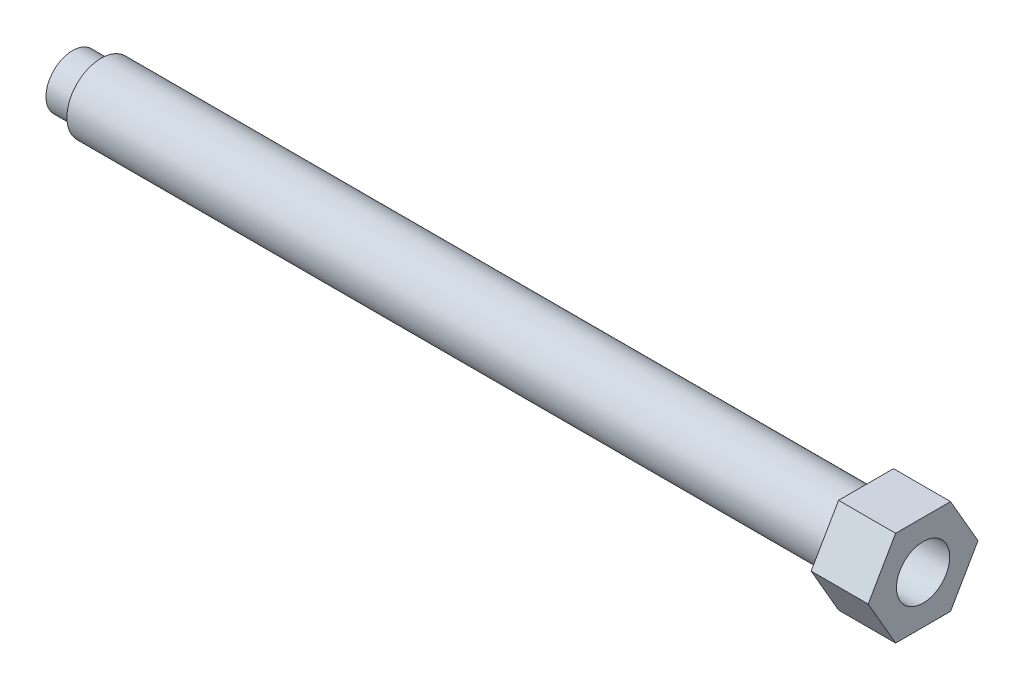
ISO-10303-21;
HEADER;
FILE_DESCRIPTION(('STEP AP214'),'2;1');
FILE_NAME('part.step','',(''),(''),'','','');
FILE_SCHEMA(('AUTOMOTIVE_DESIGN { 1 0 10303 214 1 1 1 1 }'));
ENDSEC;
DATA;
#1=APPLICATION_CONTEXT('core data for automotive mechanical design processes');
#2=APPLICATION_PROTOCOL_DEFINITION('international standard','automotive_design',2000,#1);
#3=PRODUCT_CONTEXT('',#1,'mechanical');
#4=PRODUCT('Part','Part','',(#3));
#5=PRODUCT_RELATED_PRODUCT_CATEGORY('part','',(#4));
#6=PRODUCT_DEFINITION_FORMATION('','',#4);
#7=PRODUCT_DEFINITION_CONTEXT('part definition',#1,'design');
#8=PRODUCT_DEFINITION('design','',#6,#7);
#9=PRODUCT_DEFINITION_SHAPE('','',#8);
#10=(LENGTH_UNIT() NAMED_UNIT(*) SI_UNIT(.MILLI.,.METRE.));
#11=(NAMED_UNIT(*) PLANE_ANGLE_UNIT() SI_UNIT($,.RADIAN.));
#12=(NAMED_UNIT(*) SI_UNIT($,.STERADIAN.) SOLID_ANGLE_UNIT());
#13=UNCERTAINTY_MEASURE_WITH_UNIT(LENGTH_MEASURE(1.E-05),#10,'distance_accuracy_value','');
#14=(GEOMETRIC_REPRESENTATION_CONTEXT(3) GLOBAL_UNCERTAINTY_ASSIGNED_CONTEXT((#13)) GLOBAL_UNIT_ASSIGNED_CONTEXT((#10,
#11,#12)) REPRESENTATION_CONTEXT('',''));
#15=CARTESIAN_POINT('',(0.,0.,0.));
#16=DIRECTION('',(0.,0.,1.));
#17=DIRECTION('',(1.,0.,0.));
#18=AXIS2_PLACEMENT_3D('',#15,#16,#17);
#19=CARTESIAN_POINT('',(-127.687371879,0.,0.));
#20=DIRECTION('',(1.,0.,0.));
#21=DIRECTION('',(0.,0.,-1.));
#22=AXIS2_PLACEMENT_3D('',#19,#20,#21);
#23=PLANE('',#22);
#24=CARTESIAN_POINT('',(-127.687371879,0.,0.));
#25=DIRECTION('',(1.,0.,0.));
#26=DIRECTION('',(0.,0.,-1.));
#27=AXIS2_PLACEMENT_3D('',#24,#25,#26);
#28=CIRCLE('',#27,11.43);
#29=CARTESIAN_POINT('',(-127.687371879,0.,-11.43));
#30=VERTEX_POINT('',#29);
#31=EDGE_CURVE('E155',#30,#30,#28,.T.);
#32=ORIENTED_EDGE('',*,*,#31,.F.);
#33=EDGE_LOOP('',(#32));
#34=FACE_BOUND('',#33,.T.);
#35=CARTESIAN_POINT('',(-127.687371879,0.,0.));
#36=DIRECTION('',(1.,0.,0.));
#37=DIRECTION('',(0.,0.,-1.));
#38=AXIS2_PLACEMENT_3D('',#35,#36,#37);
#39=CIRCLE('',#38,8.89);
#40=CARTESIAN_POINT('',(-127.687371879,0.,-8.89));
#41=VERTEX_POINT('',#40);
#42=EDGE_CURVE('E12',#41,#41,#39,.F.);
#43=ORIENTED_EDGE('',*,*,#42,.F.);
#44=EDGE_LOOP('',(#43));
#45=FACE_BOUND('',#44,.T.);
#46=ADVANCED_FACE('F45',(#34,#45),#23,.F.);
#47=CARTESIAN_POINT('',(127.687371879,0.,0.));
#48=DIRECTION('',(1.,0.,0.));
#49=DIRECTION('',(0.,0.,-1.));
#50=AXIS2_PLACEMENT_3D('',#47,#48,#49);
#51=PLANE('',#50);
#52=CARTESIAN_POINT('',(127.687371879,0.,0.));
#53=DIRECTION('',(1.,0.,0.));
#54=DIRECTION('',(0.,0.,-1.));
#55=AXIS2_PLACEMENT_3D('',#52,#53,#54);
#56=CIRCLE('',#55,6.35);
#57=CARTESIAN_POINT('',(127.687371879,0.,-6.35));
#58=VERTEX_POINT('',#57);
#59=EDGE_CURVE('E152',#58,#58,#56,.T.);
#60=ORIENTED_EDGE('',*,*,#59,.F.);
#61=EDGE_LOOP('',(#60));
#62=FACE_BOUND('',#61,.T.);
#63=CARTESIAN_POINT('',(127.687371879,0.,0.));
#64=DIRECTION('',(1.,0.,0.));
#65=DIRECTION('',(0.,0.,-1.));
#66=AXIS2_PLACEMENT_3D('',#63,#64,#65);
#67=CIRCLE('',#66,8.89);
#68=CARTESIAN_POINT('',(127.687371879,0.,8.89));
#69=VERTEX_POINT('',#68);
#70=EDGE_CURVE('E220',#69,#69,#67,.T.);
#71=ORIENTED_EDGE('',*,*,#70,.T.);
#72=EDGE_LOOP('',(#71));
#73=FACE_BOUND('',#72,.T.);
#74=ADVANCED_FACE('F163',(#62,#73),#51,.T.);
#75=CARTESIAN_POINT('',(-127.687371879,0.,0.));
#76=DIRECTION('',(1.,0.,0.));
#77=DIRECTION('',(0.,0.,-1.));
#78=AXIS2_PLACEMENT_3D('',#75,#76,#77);
#79=CYLINDRICAL_SURFACE('',#78,11.43);
#80=CARTESIAN_POINT('',(127.687371879,0.,0.));
#81=DIRECTION('',(1.,0.,0.));
#82=DIRECTION('',(0.,0.,-1.));
#83=AXIS2_PLACEMENT_3D('',#80,#81,#82);
#84=CIRCLE('',#83,11.43);
#85=CARTESIAN_POINT('',(127.687371879,0.,-11.43));
#86=VERTEX_POINT('',#85);
#87=EDGE_CURVE('E54',#86,#86,#84,.T.);
#88=ORIENTED_EDGE('',*,*,#87,.F.);
#89=EDGE_LOOP('',(#88));
#90=FACE_BOUND('',#89,.T.);
#91=ORIENTED_EDGE('',*,*,#31,.T.);
#92=EDGE_LOOP('',(#91));
#93=FACE_BOUND('',#92,.T.);
#94=ADVANCED_FACE('F47',(#90,#93),#79,.T.);
#95=CARTESIAN_POINT('',(-127.687371879,0.,0.));
#96=DIRECTION('',(1.,0.,0.));
#97=DIRECTION('',(0.,0.,-1.));
#98=AXIS2_PLACEMENT_3D('',#95,#96,#97);
#99=CYLINDRICAL_SURFACE('',#98,6.35);
#100=ORIENTED_EDGE('',*,*,#59,.T.);
#101=EDGE_LOOP('',(#100));
#102=FACE_BOUND('',#101,.T.);
#103=CARTESIAN_POINT('',(-137.212371879,0.,0.));
#104=DIRECTION('',(-1.,0.,0.));
#105=DIRECTION('',(0.,0.,1.));
#106=AXIS2_PLACEMENT_3D('',#103,#104,#105);
#107=CIRCLE('',#106,6.35);
#108=CARTESIAN_POINT('',(-137.212371879,0.,6.35));
#109=VERTEX_POINT('',#108);
#110=EDGE_CURVE('E227',#109,#109,#107,.T.);
#111=ORIENTED_EDGE('',*,*,#110,.T.);
#112=EDGE_LOOP('',(#111));
#113=FACE_BOUND('',#112,.T.);
#114=ADVANCED_FACE('F189',(#102,#113),#99,.F.);
#115=CARTESIAN_POINT('',(127.687371879,0.,0.));
#116=DIRECTION('',(1.,0.,0.));
#117=DIRECTION('',(0.,0.,-1.));
#118=AXIS2_PLACEMENT_3D('',#115,#116,#117);
#119=PLANE('',#118);
#120=DIRECTION('',(0.,0.866025403784438,0.5));
#121=VECTOR('',#120,1.);
#122=CARTESIAN_POINT('',(127.687371879,0.,-18.3308710467706));
#123=LINE('',#122,#121);
#124=CARTESIAN_POINT('',(127.687371879,0.,-18.3308710467706));
#125=VERTEX_POINT('',#124);
#126=CARTESIAN_POINT('',(127.687371879,15.875,-9.1654355233853));
#127=VERTEX_POINT('',#126);
#128=EDGE_CURVE('E132',#125,#127,#123,.T.);
#129=ORIENTED_EDGE('',*,*,#128,.F.);
#130=DIRECTION('',(0.,0.866025403784439,-0.5));
#131=VECTOR('',#130,1.);
#132=CARTESIAN_POINT('',(127.687371879,-15.875,-9.16543552338531));
#133=LINE('',#132,#131);
#134=CARTESIAN_POINT('',(127.687371879,-15.875,-9.16543552338531));
#135=VERTEX_POINT('',#134);
#136=EDGE_CURVE('E91',#135,#125,#133,.T.);
#137=ORIENTED_EDGE('',*,*,#136,.F.);
#138=DIRECTION('',(0.,0.,-1.));
#139=VECTOR('',#138,1.);
#140=CARTESIAN_POINT('',(127.687371879,-15.875,9.16543552338531));
#141=LINE('',#140,#139);
#142=CARTESIAN_POINT('',(127.687371879,-15.875,9.16543552338531));
#143=VERTEX_POINT('',#142);
#144=EDGE_CURVE('E85',#143,#135,#141,.T.);
#145=ORIENTED_EDGE('',*,*,#144,.F.);
#146=DIRECTION('',(0.,-0.866025403784438,-0.5));
#147=VECTOR('',#146,1.);
#148=CARTESIAN_POINT('',(127.687371879,0.,18.3308710467706));
#149=LINE('',#148,#147);
#150=CARTESIAN_POINT('',(127.687371879,0.,18.3308710467706));
#151=VERTEX_POINT('',#150);
#152=EDGE_CURVE('E122',#151,#143,#149,.T.);
#153=ORIENTED_EDGE('',*,*,#152,.F.);
#154=DIRECTION('',(0.,-0.866025403784438,0.5));
#155=VECTOR('',#154,1.);
#156=CARTESIAN_POINT('',(127.687371879,15.875,9.16543552338531));
#157=LINE('',#156,#155);
#158=CARTESIAN_POINT('',(127.687371879,15.875,9.16543552338531));
#159=VERTEX_POINT('',#158);
#160=EDGE_CURVE('E138',#159,#151,#157,.T.);
#161=ORIENTED_EDGE('',*,*,#160,.F.);
#162=DIRECTION('',(0.,0.,1.));
#163=VECTOR('',#162,1.);
#164=CARTESIAN_POINT('',(127.687371879,15.875,-9.1654355233853));
#165=LINE('',#164,#163);
#166=EDGE_CURVE('E135',#127,#159,#165,.T.);
#167=ORIENTED_EDGE('',*,*,#166,.F.);
#168=EDGE_LOOP('',(#129,#137,#145,#153,#161,#167));
#169=FACE_BOUND('',#168,.T.);
#170=ORIENTED_EDGE('',*,*,#87,.T.);
#171=EDGE_LOOP('',(#170));
#172=FACE_BOUND('',#171,.T.);
#173=ADVANCED_FACE('F186',(#169,#172),#119,.F.);
#174=CARTESIAN_POINT('',(146.737371879,0.,0.));
#175=DIRECTION('',(1.,0.,0.));
#176=DIRECTION('',(0.,0.,-1.));
#177=AXIS2_PLACEMENT_3D('',#174,#175,#176);
#178=PLANE('',#177);
#179=DIRECTION('',(0.,0.866025403784438,0.5));
#180=VECTOR('',#179,1.);
#181=CARTESIAN_POINT('',(146.737371879,0.,-18.3308710467706));
#182=LINE('',#181,#180);
#183=CARTESIAN_POINT('',(146.737371879,0.,-18.3308710467706));
#184=VERTEX_POINT('',#183);
#185=CARTESIAN_POINT('',(146.737371879,15.875,-9.1654355233853));
#186=VERTEX_POINT('',#185);
#187=EDGE_CURVE('E143',#184,#186,#182,.T.);
#188=ORIENTED_EDGE('',*,*,#187,.T.);
#189=DIRECTION('',(0.,0.,1.));
#190=VECTOR('',#189,1.);
#191=CARTESIAN_POINT('',(146.737371879,15.875,-9.1654355233853));
#192=LINE('',#191,#190);
#193=CARTESIAN_POINT('',(146.737371879,15.875,9.16543552338531));
#194=VERTEX_POINT('',#193);
#195=EDGE_CURVE('E100',#186,#194,#192,.T.);
#196=ORIENTED_EDGE('',*,*,#195,.T.);
#197=DIRECTION('',(0.,-0.866025403784438,0.5));
#198=VECTOR('',#197,1.);
#199=CARTESIAN_POINT('',(146.737371879,15.875,9.16543552338531));
#200=LINE('',#199,#198);
#201=CARTESIAN_POINT('',(146.737371879,0.,18.3308710467706));
#202=VERTEX_POINT('',#201);
#203=EDGE_CURVE('E114',#194,#202,#200,.T.);
#204=ORIENTED_EDGE('',*,*,#203,.T.);
#205=DIRECTION('',(0.,-0.866025403784438,-0.5));
#206=VECTOR('',#205,1.);
#207=CARTESIAN_POINT('',(146.737371879,0.,18.3308710467706));
#208=LINE('',#207,#206);
#209=CARTESIAN_POINT('',(146.737371879,-15.875,9.16543552338531));
#210=VERTEX_POINT('',#209);
#211=EDGE_CURVE('E107',#202,#210,#208,.T.);
#212=ORIENTED_EDGE('',*,*,#211,.T.);
#213=DIRECTION('',(0.,0.,-1.));
#214=VECTOR('',#213,1.);
#215=CARTESIAN_POINT('',(146.737371879,-15.875,9.16543552338531));
#216=LINE('',#215,#214);
#217=CARTESIAN_POINT('',(146.737371879,-15.875,-9.16543552338531));
#218=VERTEX_POINT('',#217);
#219=EDGE_CURVE('E112',#210,#218,#216,.T.);
#220=ORIENTED_EDGE('',*,*,#219,.T.);
#221=DIRECTION('',(0.,0.866025403784439,-0.5));
#222=VECTOR('',#221,1.);
#223=CARTESIAN_POINT('',(146.737371879,-15.875,-9.16543552338531));
#224=LINE('',#223,#222);
#225=EDGE_CURVE('E62',#218,#184,#224,.T.);
#226=ORIENTED_EDGE('',*,*,#225,.T.);
#227=EDGE_LOOP('',(#188,#196,#204,#212,#220,#226));
#228=FACE_BOUND('',#227,.T.);
#229=CARTESIAN_POINT('',(146.737371879,0.,0.));
#230=DIRECTION('',(1.,0.,0.));
#231=DIRECTION('',(0.,0.,-1.));
#232=AXIS2_PLACEMENT_3D('',#229,#230,#231);
#233=CIRCLE('',#232,8.89);
#234=CARTESIAN_POINT('',(146.737371879,0.,8.89));
#235=VERTEX_POINT('',#234);
#236=EDGE_CURVE('E136',#235,#235,#233,.T.);
#237=ORIENTED_EDGE('',*,*,#236,.F.);
#238=EDGE_LOOP('',(#237));
#239=FACE_BOUND('',#238,.T.);
#240=ADVANCED_FACE('F109',(#228,#239),#178,.T.);
#241=CARTESIAN_POINT('',(146.737371879,0.,-18.3308710467706));
#242=DIRECTION('',(0.,-0.5,0.866025403784438));
#243=DIRECTION('',(0.,-0.866025403784438,-0.5));
#244=AXIS2_PLACEMENT_3D('',#241,#242,#243);
#245=PLANE('',#244);
#246=ORIENTED_EDGE('',*,*,#128,.T.);
#247=DIRECTION('',(-1.,0.,0.));
#248=VECTOR('',#247,1.);
#249=CARTESIAN_POINT('',(146.737371879,15.875,-9.1654355233853));
#250=LINE('',#249,#248);
#251=EDGE_CURVE('E150',#186,#127,#250,.T.);
#252=ORIENTED_EDGE('',*,*,#251,.F.);
#253=ORIENTED_EDGE('',*,*,#187,.F.);
#254=DIRECTION('',(-1.,0.,0.));
#255=VECTOR('',#254,1.);
#256=CARTESIAN_POINT('',(146.737371879,0.,-18.3308710467706));
#257=LINE('',#256,#255);
#258=EDGE_CURVE('E128',#184,#125,#257,.T.);
#259=ORIENTED_EDGE('',*,*,#258,.T.);
#260=EDGE_LOOP('',(#246,#252,#253,#259));
#261=FACE_BOUND('',#260,.T.);
#262=ADVANCED_FACE('F185',(#261),#245,.F.);
#263=CARTESIAN_POINT('',(146.737371879,15.875,-9.1654355233853));
#264=DIRECTION('',(0.,-1.,0.));
#265=DIRECTION('',(0.,0.,-1.));
#266=AXIS2_PLACEMENT_3D('',#263,#264,#265);
#267=PLANE('',#266);
#268=ORIENTED_EDGE('',*,*,#166,.T.);
#269=DIRECTION('',(-1.,0.,0.));
#270=VECTOR('',#269,1.);
#271=CARTESIAN_POINT('',(146.737371879,15.875,9.16543552338531));
#272=LINE('',#271,#270);
#273=EDGE_CURVE('E147',#194,#159,#272,.T.);
#274=ORIENTED_EDGE('',*,*,#273,.F.);
#275=ORIENTED_EDGE('',*,*,#195,.F.);
#276=ORIENTED_EDGE('',*,*,#251,.T.);
#277=EDGE_LOOP('',(#268,#274,#275,#276));
#278=FACE_BOUND('',#277,.T.);
#279=ADVANCED_FACE('F200',(#278),#267,.F.);
#280=CARTESIAN_POINT('',(146.737371879,15.875,9.16543552338531));
#281=DIRECTION('',(0.,-0.5,-0.866025403784439));
#282=DIRECTION('',(0.,0.866025403784438,-0.5));
#283=AXIS2_PLACEMENT_3D('',#280,#281,#282);
#284=PLANE('',#283);
#285=ORIENTED_EDGE('',*,*,#160,.T.);
#286=DIRECTION('',(-1.,0.,0.));
#287=VECTOR('',#286,1.);
#288=CARTESIAN_POINT('',(146.737371879,0.,18.3308710467706));
#289=LINE('',#288,#287);
#290=EDGE_CURVE('E123',#202,#151,#289,.T.);
#291=ORIENTED_EDGE('',*,*,#290,.F.);
#292=ORIENTED_EDGE('',*,*,#203,.F.);
#293=ORIENTED_EDGE('',*,*,#273,.T.);
#294=EDGE_LOOP('',(#285,#291,#292,#293));
#295=FACE_BOUND('',#294,.T.);
#296=ADVANCED_FACE('F197',(#295),#284,.F.);
#297=CARTESIAN_POINT('',(146.737371879,0.,18.3308710467706));
#298=DIRECTION('',(0.,0.5,-0.866025403784439));
#299=DIRECTION('',(0.,0.866025403784438,0.5));
#300=AXIS2_PLACEMENT_3D('',#297,#298,#299);
#301=PLANE('',#300);
#302=ORIENTED_EDGE('',*,*,#152,.T.);
#303=DIRECTION('',(-1.,0.,0.));
#304=VECTOR('',#303,1.);
#305=CARTESIAN_POINT('',(146.737371879,-15.875,9.16543552338531));
#306=LINE('',#305,#304);
#307=EDGE_CURVE('E119',#210,#143,#306,.T.);
#308=ORIENTED_EDGE('',*,*,#307,.F.);
#309=ORIENTED_EDGE('',*,*,#211,.F.);
#310=ORIENTED_EDGE('',*,*,#290,.T.);
#311=EDGE_LOOP('',(#302,#308,#309,#310));
#312=FACE_BOUND('',#311,.T.);
#313=ADVANCED_FACE('F120',(#312),#301,.F.);
#314=CARTESIAN_POINT('',(146.737371879,-15.875,9.16543552338531));
#315=DIRECTION('',(0.,1.,0.));
#316=DIRECTION('',(0.,0.,1.));
#317=AXIS2_PLACEMENT_3D('',#314,#315,#316);
#318=PLANE('',#317);
#319=ORIENTED_EDGE('',*,*,#144,.T.);
#320=DIRECTION('',(-1.,0.,0.));
#321=VECTOR('',#320,1.);
#322=CARTESIAN_POINT('',(146.737371879,-15.875,-9.16543552338531));
#323=LINE('',#322,#321);
#324=EDGE_CURVE('E124',#218,#135,#323,.T.);
#325=ORIENTED_EDGE('',*,*,#324,.F.);
#326=ORIENTED_EDGE('',*,*,#219,.F.);
#327=ORIENTED_EDGE('',*,*,#307,.T.);
#328=EDGE_LOOP('',(#319,#325,#326,#327));
#329=FACE_BOUND('',#328,.T.);
#330=ADVANCED_FACE('F126',(#329),#318,.F.);
#331=CARTESIAN_POINT('',(146.737371879,-15.875,-9.16543552338531));
#332=DIRECTION('',(0.,0.5,0.866025403784439));
#333=DIRECTION('',(0.,-0.866025403784438,0.5));
#334=AXIS2_PLACEMENT_3D('',#331,#332,#333);
#335=PLANE('',#334);
#336=ORIENTED_EDGE('',*,*,#136,.T.);
#337=ORIENTED_EDGE('',*,*,#258,.F.);
#338=ORIENTED_EDGE('',*,*,#225,.F.);
#339=ORIENTED_EDGE('',*,*,#324,.T.);
#340=EDGE_LOOP('',(#336,#337,#338,#339));
#341=FACE_BOUND('',#340,.T.);
#342=ADVANCED_FACE('F181',(#341),#335,.F.);
#343=CARTESIAN_POINT('',(146.737371879,0.,0.));
#344=DIRECTION('',(-1.,0.,0.));
#345=DIRECTION('',(0.,0.,1.));
#346=AXIS2_PLACEMENT_3D('',#343,#344,#345);
#347=CYLINDRICAL_SURFACE('',#346,8.89);
#348=CARTESIAN_POINT('',(146.737371879,0.,8.89));
#349=CARTESIAN_POINT('',(146.538934379,0.,8.89));
#350=CARTESIAN_POINT('',(146.340496879,0.,8.89));
#351=CARTESIAN_POINT('',(145.943621879,0.,8.89));
#352=CARTESIAN_POINT('',(145.745184379,0.,8.89));
#353=CARTESIAN_POINT('',(145.348309379,0.,8.89));
#354=CARTESIAN_POINT('',(145.149871879,0.,8.89));
#355=CARTESIAN_POINT('',(144.752996879,0.,8.89));
#356=CARTESIAN_POINT('',(144.554559379,0.,8.89));
#357=CARTESIAN_POINT('',(144.157684379,0.,8.89));
#358=CARTESIAN_POINT('',(143.959246879,0.,8.89));
#359=CARTESIAN_POINT('',(143.562371879,0.,8.89));
#360=CARTESIAN_POINT('',(143.363934379,0.,8.89));
#361=CARTESIAN_POINT('',(142.967059379,0.,8.89));
#362=CARTESIAN_POINT('',(142.768621879,0.,8.89));
#363=CARTESIAN_POINT('',(142.371746879,0.,8.89));
#364=CARTESIAN_POINT('',(142.173309379,0.,8.89));
#365=CARTESIAN_POINT('',(141.776434379,0.,8.89));
#366=CARTESIAN_POINT('',(141.577996879,0.,8.89));
#367=CARTESIAN_POINT('',(141.181121879,0.,8.89));
#368=CARTESIAN_POINT('',(140.982684379,0.,8.89));
#369=CARTESIAN_POINT('',(140.585809379,0.,8.89));
#370=CARTESIAN_POINT('',(140.387371879,0.,8.89));
#371=CARTESIAN_POINT('',(139.990496879,0.,8.89));
#372=CARTESIAN_POINT('',(139.792059379,0.,8.89));
#373=CARTESIAN_POINT('',(139.395184379,0.,8.89));
#374=CARTESIAN_POINT('',(139.196746879,0.,8.89));
#375=CARTESIAN_POINT('',(138.799871879,0.,8.89));
#376=CARTESIAN_POINT('',(138.601434379,0.,8.89));
#377=CARTESIAN_POINT('',(138.204559379,0.,8.89));
#378=CARTESIAN_POINT('',(138.006121879,0.,8.89));
#379=CARTESIAN_POINT('',(137.609246879,0.,8.89));
#380=CARTESIAN_POINT('',(137.410809379,0.,8.89));
#381=CARTESIAN_POINT('',(137.013934379,0.,8.89));
#382=CARTESIAN_POINT('',(136.815496879,0.,8.89));
#383=CARTESIAN_POINT('',(136.418621879,0.,8.89));
#384=CARTESIAN_POINT('',(136.220184379,0.,8.89));
#385=CARTESIAN_POINT('',(135.823309379,0.,8.89));
#386=CARTESIAN_POINT('',(135.624871879,0.,8.89));
#387=CARTESIAN_POINT('',(135.227996879,0.,8.89));
#388=CARTESIAN_POINT('',(135.029559379,0.,8.89));
#389=CARTESIAN_POINT('',(134.632684379,0.,8.89));
#390=CARTESIAN_POINT('',(134.434246879,0.,8.89));
#391=CARTESIAN_POINT('',(134.037371879,0.,8.89));
#392=CARTESIAN_POINT('',(133.838934379,0.,8.89));
#393=CARTESIAN_POINT('',(133.442059379,0.,8.89));
#394=CARTESIAN_POINT('',(133.243621879,0.,8.89));
#395=CARTESIAN_POINT('',(132.846746879,0.,8.89));
#396=CARTESIAN_POINT('',(132.648309379,0.,8.89));
#397=CARTESIAN_POINT('',(132.251434379,0.,8.89));
#398=CARTESIAN_POINT('',(132.052996879,0.,8.89));
#399=CARTESIAN_POINT('',(131.656121879,0.,8.89));
#400=CARTESIAN_POINT('',(131.457684379,0.,8.89));
#401=CARTESIAN_POINT('',(131.060809379,0.,8.89));
#402=CARTESIAN_POINT('',(130.862371879,0.,8.89));
#403=CARTESIAN_POINT('',(130.465496879,0.,8.89));
#404=CARTESIAN_POINT('',(130.267059379,0.,8.89));
#405=CARTESIAN_POINT('',(129.870184379,0.,8.89));
#406=CARTESIAN_POINT('',(129.671746879,0.,8.89));
#407=CARTESIAN_POINT('',(129.274871879,0.,8.89));
#408=CARTESIAN_POINT('',(129.076434379,0.,8.89));
#409=CARTESIAN_POINT('',(128.679559379,0.,8.89));
#410=CARTESIAN_POINT('',(128.481121879,0.,8.89));
#411=CARTESIAN_POINT('',(128.084246879,0.,8.89));
#412=CARTESIAN_POINT('',(127.885809379,0.,8.89));
#413=CARTESIAN_POINT('',(127.687371879,0.,8.89));
#414=B_SPLINE_CURVE_WITH_KNOTS('',3,(#348,#349,#350,#351,#352,#353,#354,#355,#356,#357,#358,
#359,#360,#361,#362,#363,#364,#365,#366,#367,#368,#369,#370,#371,#372,#373,#374,#375,#376,#377,
#378,#379,#380,#381,#382,#383,#384,#385,#386,#387,#388,#389,#390,#391,#392,#393,#394,#395,#396,
#397,#398,#399,#400,#401,#402,#403,#404,#405,#406,#407,#408,#409,#410,#411,#412,#413),
.UNSPECIFIED.,.F.,.F.,(4,2,2,2,2,2,2,2,2,2,2,2,2,2,2,2,2,2,2,2,2,2,2,2,2,2,2,2,2,2,2,2,4),(0.,
0.5953125,1.190625,1.7859375,2.38125,2.9765625,3.571875,4.1671875,4.7625,5.3578125,5.953125,
6.5484375,7.14375,7.7390625,8.334375,8.92968750000001,9.52500000000001,10.1203125,10.715625,
11.3109375,11.90625,12.5015625,13.096875,13.6921875,14.2875,14.8828125,15.478125,16.0734375,
16.66875,17.2640625,17.859375,18.4546875,19.05),.UNSPECIFIED.);
#415=EDGE_CURVE('BSEAM174',#235,#69,#414,.T.);
#416=ORIENTED_EDGE('',*,*,#236,.T.);
#417=ORIENTED_EDGE('',*,*,#70,.F.);
#418=ORIENTED_EDGE('',*,*,#415,.T.);
#419=ORIENTED_EDGE('',*,*,#415,.F.);
#420=EDGE_LOOP('',(#416,#418,#417,#419));
#421=FACE_BOUND('',#420,.T.);
#422=ADVANCED_FACE('F174',(#421),#347,.F.);
#423=CARTESIAN_POINT('',(-137.212371879,0.,0.));
#424=DIRECTION('',(-1.,0.,0.));
#425=DIRECTION('',(0.,0.,1.));
#426=AXIS2_PLACEMENT_3D('',#423,#424,#425);
#427=PLANE('',#426);
#428=CARTESIAN_POINT('',(-137.212371879,0.,0.));
#429=DIRECTION('',(-1.,0.,0.));
#430=DIRECTION('',(0.,0.,1.));
#431=AXIS2_PLACEMENT_3D('',#428,#429,#430);
#432=CIRCLE('',#431,8.89);
#433=CARTESIAN_POINT('',(-137.212371879,0.,-8.89));
#434=VERTEX_POINT('',#433);
#435=EDGE_CURVE('E222',#434,#434,#432,.T.);
#436=ORIENTED_EDGE('',*,*,#435,.T.);
#437=EDGE_LOOP('',(#436));
#438=FACE_BOUND('',#437,.T.);
#439=ORIENTED_EDGE('',*,*,#110,.F.);
#440=EDGE_LOOP('',(#439));
#441=FACE_BOUND('',#440,.T.);
#442=ADVANCED_FACE('F168',(#438,#441),#427,.T.);
#443=CARTESIAN_POINT('',(-137.212371879,0.,0.));
#444=DIRECTION('',(1.,0.,0.));
#445=DIRECTION('',(0.,0.,-1.));
#446=AXIS2_PLACEMENT_3D('',#443,#444,#445);
#447=CYLINDRICAL_SURFACE('',#446,8.89);
#448=CARTESIAN_POINT('',(-137.212371879,0.,-8.89));
#449=CARTESIAN_POINT('',(-137.113153129,0.,-8.89));
#450=CARTESIAN_POINT('',(-137.013934379,0.,-8.89));
#451=CARTESIAN_POINT('',(-136.815496879,0.,-8.89));
#452=CARTESIAN_POINT('',(-136.716278129,0.,-8.89));
#453=CARTESIAN_POINT('',(-136.517840629,0.,-8.89));
#454=CARTESIAN_POINT('',(-136.418621879,0.,-8.89));
#455=CARTESIAN_POINT('',(-136.220184379,0.,-8.89));
#456=CARTESIAN_POINT('',(-136.120965629,0.,-8.89));
#457=CARTESIAN_POINT('',(-135.922528129,0.,-8.89));
#458=CARTESIAN_POINT('',(-135.823309379,0.,-8.89));
#459=CARTESIAN_POINT('',(-135.624871879,0.,-8.89));
#460=CARTESIAN_POINT('',(-135.525653129,0.,-8.89));
#461=CARTESIAN_POINT('',(-135.327215629,0.,-8.89));
#462=CARTESIAN_POINT('',(-135.227996879,0.,-8.89));
#463=CARTESIAN_POINT('',(-135.029559379,0.,-8.89));
#464=CARTESIAN_POINT('',(-134.930340629,0.,-8.89));
#465=CARTESIAN_POINT('',(-134.731903129,0.,-8.89));
#466=CARTESIAN_POINT('',(-134.632684379,0.,-8.89));
#467=CARTESIAN_POINT('',(-134.434246879,0.,-8.89));
#468=CARTESIAN_POINT('',(-134.335028129,0.,-8.89));
#469=CARTESIAN_POINT('',(-134.136590629,0.,-8.89));
#470=CARTESIAN_POINT('',(-134.037371879,0.,-8.89));
#471=CARTESIAN_POINT('',(-133.838934379,0.,-8.89));
#472=CARTESIAN_POINT('',(-133.739715629,0.,-8.89));
#473=CARTESIAN_POINT('',(-133.541278129,0.,-8.89));
#474=CARTESIAN_POINT('',(-133.442059379,0.,-8.89));
#475=CARTESIAN_POINT('',(-133.243621879,0.,-8.89));
#476=CARTESIAN_POINT('',(-133.144403129,0.,-8.89));
#477=CARTESIAN_POINT('',(-132.945965629,0.,-8.89));
#478=CARTESIAN_POINT('',(-132.846746879,0.,-8.89));
#479=CARTESIAN_POINT('',(-132.648309379,0.,-8.89));
#480=CARTESIAN_POINT('',(-132.549090629,0.,-8.89));
#481=CARTESIAN_POINT('',(-132.350653129,0.,-8.89));
#482=CARTESIAN_POINT('',(-132.251434379,0.,-8.89));
#483=CARTESIAN_POINT('',(-132.052996879,0.,-8.89));
#484=CARTESIAN_POINT('',(-131.953778129,0.,-8.89));
#485=CARTESIAN_POINT('',(-131.755340629,0.,-8.89));
#486=CARTESIAN_POINT('',(-131.656121879,0.,-8.89));
#487=CARTESIAN_POINT('',(-131.457684379,0.,-8.89));
#488=CARTESIAN_POINT('',(-131.358465629,0.,-8.89));
#489=CARTESIAN_POINT('',(-131.160028129,0.,-8.89));
#490=CARTESIAN_POINT('',(-131.060809379,0.,-8.89));
#491=CARTESIAN_POINT('',(-130.862371879,0.,-8.89));
#492=CARTESIAN_POINT('',(-130.763153129,0.,-8.89));
#493=CARTESIAN_POINT('',(-130.564715629,0.,-8.89));
#494=CARTESIAN_POINT('',(-130.465496879,0.,-8.89));
#495=CARTESIAN_POINT('',(-130.267059379,0.,-8.89));
#496=CARTESIAN_POINT('',(-130.167840629,0.,-8.89));
#497=CARTESIAN_POINT('',(-129.969403129,0.,-8.89));
#498=CARTESIAN_POINT('',(-129.870184379,0.,-8.89));
#499=CARTESIAN_POINT('',(-129.671746879,0.,-8.89));
#500=CARTESIAN_POINT('',(-129.572528129,0.,-8.89));
#501=CARTESIAN_POINT('',(-129.374090629,0.,-8.89));
#502=CARTESIAN_POINT('',(-129.274871879,0.,-8.89));
#503=CARTESIAN_POINT('',(-129.076434379,0.,-8.89));
#504=CARTESIAN_POINT('',(-128.977215629,0.,-8.89));
#505=CARTESIAN_POINT('',(-128.778778129,0.,-8.89));
#506=CARTESIAN_POINT('',(-128.679559379,0.,-8.89));
#507=CARTESIAN_POINT('',(-128.481121879,0.,-8.89));
#508=CARTESIAN_POINT('',(-128.381903129,0.,-8.89));
#509=CARTESIAN_POINT('',(-128.183465629,0.,-8.89));
#510=CARTESIAN_POINT('',(-128.084246879,0.,-8.89));
#511=CARTESIAN_POINT('',(-127.885809379,0.,-8.89));
#512=CARTESIAN_POINT('',(-127.786590629,0.,-8.89));
#513=CARTESIAN_POINT('',(-127.687371879,0.,-8.89));
#514=B_SPLINE_CURVE_WITH_KNOTS('',3,(#448,#449,#450,#451,#452,#453,#454,#455,#456,#457,#458,
#459,#460,#461,#462,#463,#464,#465,#466,#467,#468,#469,#470,#471,#472,#473,#474,#475,#476,#477,
#478,#479,#480,#481,#482,#483,#484,#485,#486,#487,#488,#489,#490,#491,#492,#493,#494,#495,#496,
#497,#498,#499,#500,#501,#502,#503,#504,#505,#506,#507,#508,#509,#510,#511,#512,#513),
.UNSPECIFIED.,.F.,.F.,(4,2,2,2,2,2,2,2,2,2,2,2,2,2,2,2,2,2,2,2,2,2,2,2,2,2,2,2,2,2,2,2,4),(0.,
0.297656249999972,0.595312499999973,0.892968749999973,1.19062499999997,1.48828124999997,
1.78593749999997,2.08359374999997,2.38124999999997,2.67890624999997,2.97656249999997,
3.27421874999997,3.57187499999997,3.86953124999997,4.16718749999997,4.46484374999998,
4.76249999999998,5.06015624999998,5.35781249999998,5.65546874999998,5.95312499999998,
6.25078124999998,6.54843749999998,6.84609374999998,7.14374999999998,7.44140624999998,
7.73906249999998,8.03671874999998,8.33437499999998,8.63203124999998,8.92968749999998,
9.22734374999998,9.52499999999998),.UNSPECIFIED.);
#515=EDGE_CURVE('BSEAM166',#434,#41,#514,.T.);
#516=ORIENTED_EDGE('',*,*,#435,.F.);
#517=ORIENTED_EDGE('',*,*,#42,.T.);
#518=ORIENTED_EDGE('',*,*,#515,.T.);
#519=ORIENTED_EDGE('',*,*,#515,.F.);
#520=EDGE_LOOP('',(#516,#518,#517,#519));
#521=FACE_BOUND('',#520,.T.);
#522=ADVANCED_FACE('F166',(#521),#447,.T.);
#523=CLOSED_SHELL('',(#46,#74,#94,#114,#173,#240,#262,#279,#296,#313,#330,#342,#422,#442,#522));
#524=MANIFOLD_SOLID_BREP('B2',#523);
#525=ADVANCED_BREP_SHAPE_REPRESENTATION('',(#18,#524),#14);
#526=SHAPE_DEFINITION_REPRESENTATION(#9,#525);
ENDSEC;
END-ISO-10303-21;
